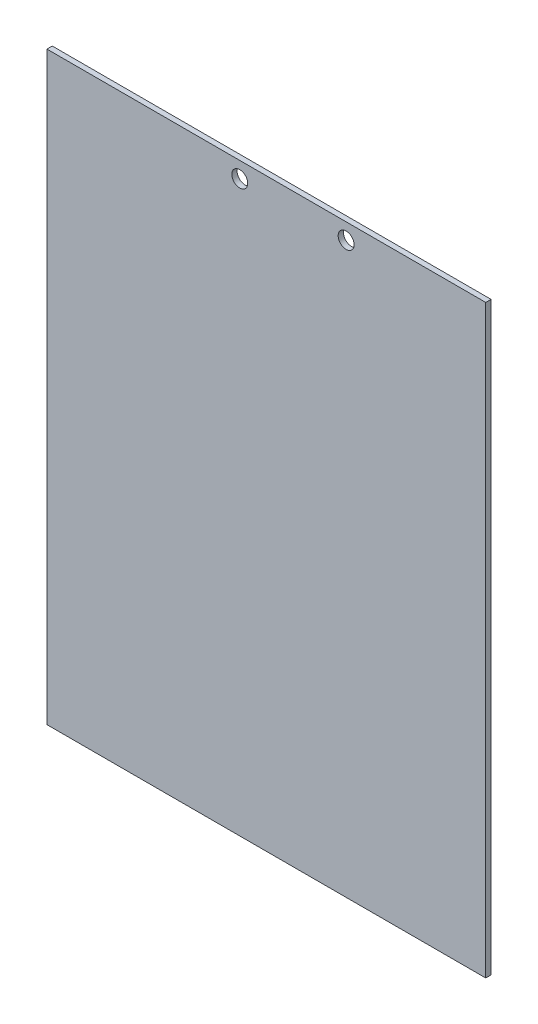
ISO-10303-21;
HEADER;
FILE_DESCRIPTION(('STEP AP214'),'2;1');
FILE_NAME('part.step','',(''),(''),'','','');
FILE_SCHEMA(('AUTOMOTIVE_DESIGN { 1 0 10303 214 1 1 1 1 }'));
ENDSEC;
DATA;
#1=APPLICATION_CONTEXT('core data for automotive mechanical design processes');
#2=APPLICATION_PROTOCOL_DEFINITION('international standard','automotive_design',2000,#1);
#3=PRODUCT_CONTEXT('',#1,'mechanical');
#4=PRODUCT('Part','Part','',(#3));
#5=PRODUCT_RELATED_PRODUCT_CATEGORY('part','',(#4));
#6=PRODUCT_DEFINITION_FORMATION('','',#4);
#7=PRODUCT_DEFINITION_CONTEXT('part definition',#1,'design');
#8=PRODUCT_DEFINITION('design','',#6,#7);
#9=PRODUCT_DEFINITION_SHAPE('','',#8);
#10=(LENGTH_UNIT() NAMED_UNIT(*) SI_UNIT(.MILLI.,.METRE.));
#11=(NAMED_UNIT(*) PLANE_ANGLE_UNIT() SI_UNIT($,.RADIAN.));
#12=(NAMED_UNIT(*) SI_UNIT($,.STERADIAN.) SOLID_ANGLE_UNIT());
#13=UNCERTAINTY_MEASURE_WITH_UNIT(LENGTH_MEASURE(1.E-05),#10,'distance_accuracy_value','');
#14=(GEOMETRIC_REPRESENTATION_CONTEXT(3) GLOBAL_UNCERTAINTY_ASSIGNED_CONTEXT((#13)) GLOBAL_UNIT_ASSIGNED_CONTEXT((#10,
#11,#12)) REPRESENTATION_CONTEXT('',''));
#15=CARTESIAN_POINT('',(0.,0.,0.));
#16=DIRECTION('',(0.,0.,1.));
#17=DIRECTION('',(1.,0.,0.));
#18=AXIS2_PLACEMENT_3D('',#15,#16,#17);
#19=CARTESIAN_POINT('',(0.,0.,1.));
#20=DIRECTION('',(0.,0.,-1.));
#21=DIRECTION('',(-1.,0.,0.));
#22=AXIS2_PLACEMENT_3D('',#19,#20,#21);
#23=PLANE('',#22);
#24=DIRECTION('',(0.,-1.,0.));
#25=VECTOR('',#24,1.);
#26=CARTESIAN_POINT('',(0.,0.,1.));
#27=LINE('',#26,#25);
#28=CARTESIAN_POINT('',(0.,110.,1.));
#29=VERTEX_POINT('',#28);
#30=CARTESIAN_POINT('',(0.,0.,1.));
#31=VERTEX_POINT('',#30);
#32=EDGE_CURVE('E93',#29,#31,#27,.T.);
#33=ORIENTED_EDGE('',*,*,#32,.T.);
#34=DIRECTION('',(1.,0.,0.));
#35=VECTOR('',#34,1.);
#36=CARTESIAN_POINT('',(0.,0.,1.));
#37=LINE('',#36,#35);
#38=CARTESIAN_POINT('',(82.5,0.,1.));
#39=VERTEX_POINT('',#38);
#40=EDGE_CURVE('E88',#31,#39,#37,.T.);
#41=ORIENTED_EDGE('',*,*,#40,.T.);
#42=DIRECTION('',(0.,1.,0.));
#43=VECTOR('',#42,1.);
#44=CARTESIAN_POINT('',(82.5,0.,1.));
#45=LINE('',#44,#43);
#46=CARTESIAN_POINT('',(82.5,110.,1.));
#47=VERTEX_POINT('',#46);
#48=EDGE_CURVE('E91',#39,#47,#45,.T.);
#49=ORIENTED_EDGE('',*,*,#48,.T.);
#50=DIRECTION('',(-1.,0.,0.));
#51=VECTOR('',#50,1.);
#52=CARTESIAN_POINT('',(0.,110.,1.));
#53=LINE('',#52,#51);
#54=EDGE_CURVE('E58',#47,#29,#53,.T.);
#55=ORIENTED_EDGE('',*,*,#54,.T.);
#56=EDGE_LOOP('',(#33,#41,#49,#55));
#57=FACE_BOUND('',#56,.T.);
#58=CARTESIAN_POINT('',(36.25,107.,1.));
#59=DIRECTION('',(0.,0.,1.));
#60=DIRECTION('',(1.,0.,0.));
#61=AXIS2_PLACEMENT_3D('',#58,#59,#60);
#62=CIRCLE('',#61,1.5);
#63=CARTESIAN_POINT('',(37.75,107.,1.));
#64=VERTEX_POINT('',#63);
#65=EDGE_CURVE('E108',#64,#64,#62,.T.);
#66=ORIENTED_EDGE('',*,*,#65,.F.);
#67=EDGE_LOOP('',(#66));
#68=FACE_BOUND('',#67,.T.);
#69=CARTESIAN_POINT('',(56.25,107.,1.));
#70=DIRECTION('',(0.,0.,1.));
#71=DIRECTION('',(1.,0.,0.));
#72=AXIS2_PLACEMENT_3D('',#69,#70,#71);
#73=CIRCLE('',#72,1.50000000000001);
#74=CARTESIAN_POINT('',(57.75,107.,1.));
#75=VERTEX_POINT('',#74);
#76=EDGE_CURVE('E123',#75,#75,#73,.T.);
#77=ORIENTED_EDGE('',*,*,#76,.F.);
#78=EDGE_LOOP('',(#77));
#79=FACE_BOUND('',#78,.T.);
#80=ADVANCED_FACE('F41',(#57,#68,#79),#23,.F.);
#81=CARTESIAN_POINT('',(0.,0.,0.));
#82=DIRECTION('',(0.,0.,-1.));
#83=DIRECTION('',(-1.,0.,0.));
#84=AXIS2_PLACEMENT_3D('',#81,#82,#83);
#85=PLANE('',#84);
#86=CARTESIAN_POINT('',(36.25,107.,0.));
#87=DIRECTION('',(0.,0.,1.));
#88=DIRECTION('',(1.,0.,0.));
#89=AXIS2_PLACEMENT_3D('',#86,#87,#88);
#90=CIRCLE('',#89,1.5);
#91=CARTESIAN_POINT('',(37.75,107.,0.));
#92=VERTEX_POINT('',#91);
#93=EDGE_CURVE('E120',#92,#92,#90,.T.);
#94=ORIENTED_EDGE('',*,*,#93,.T.);
#95=EDGE_LOOP('',(#94));
#96=FACE_BOUND('',#95,.T.);
#97=DIRECTION('',(0.,-1.,0.));
#98=VECTOR('',#97,1.);
#99=CARTESIAN_POINT('',(0.,0.,0.));
#100=LINE('',#99,#98);
#101=CARTESIAN_POINT('',(0.,110.,0.));
#102=VERTEX_POINT('',#101);
#103=CARTESIAN_POINT('',(0.,0.,0.));
#104=VERTEX_POINT('',#103);
#105=EDGE_CURVE('E105',#102,#104,#100,.T.);
#106=ORIENTED_EDGE('',*,*,#105,.F.);
#107=DIRECTION('',(-1.,0.,0.));
#108=VECTOR('',#107,1.);
#109=CARTESIAN_POINT('',(0.,110.,0.));
#110=LINE('',#109,#108);
#111=CARTESIAN_POINT('',(82.5,110.,0.));
#112=VERTEX_POINT('',#111);
#113=EDGE_CURVE('E81',#112,#102,#110,.T.);
#114=ORIENTED_EDGE('',*,*,#113,.F.);
#115=DIRECTION('',(0.,1.,0.));
#116=VECTOR('',#115,1.);
#117=CARTESIAN_POINT('',(82.5,0.,0.));
#118=LINE('',#117,#116);
#119=CARTESIAN_POINT('',(82.5,0.,0.));
#120=VERTEX_POINT('',#119);
#121=EDGE_CURVE('E75',#120,#112,#118,.T.);
#122=ORIENTED_EDGE('',*,*,#121,.F.);
#123=DIRECTION('',(1.,0.,0.));
#124=VECTOR('',#123,1.);
#125=CARTESIAN_POINT('',(0.,0.,0.));
#126=LINE('',#125,#124);
#127=EDGE_CURVE('E97',#104,#120,#126,.T.);
#128=ORIENTED_EDGE('',*,*,#127,.F.);
#129=EDGE_LOOP('',(#106,#114,#122,#128));
#130=FACE_BOUND('',#129,.T.);
#131=CARTESIAN_POINT('',(56.25,107.,0.));
#132=DIRECTION('',(0.,0.,1.));
#133=DIRECTION('',(1.,0.,0.));
#134=AXIS2_PLACEMENT_3D('',#131,#132,#133);
#135=CIRCLE('',#134,1.50000000000001);
#136=CARTESIAN_POINT('',(57.75,107.,0.));
#137=VERTEX_POINT('',#136);
#138=EDGE_CURVE('E126',#137,#137,#135,.T.);
#139=ORIENTED_EDGE('',*,*,#138,.T.);
#140=EDGE_LOOP('',(#139));
#141=FACE_BOUND('',#140,.T.);
#142=ADVANCED_FACE('F116',(#96,#130,#141),#85,.T.);
#143=CARTESIAN_POINT('',(0.,0.,1.));
#144=DIRECTION('',(1.,0.,0.));
#145=DIRECTION('',(0.,0.,-1.));
#146=AXIS2_PLACEMENT_3D('',#143,#144,#145);
#147=PLANE('',#146);
#148=ORIENTED_EDGE('',*,*,#105,.T.);
#149=DIRECTION('',(0.,0.,-1.));
#150=VECTOR('',#149,1.);
#151=CARTESIAN_POINT('',(0.,0.,1.));
#152=LINE('',#151,#150);
#153=EDGE_CURVE('E11',#31,#104,#152,.T.);
#154=ORIENTED_EDGE('',*,*,#153,.F.);
#155=ORIENTED_EDGE('',*,*,#32,.F.);
#156=DIRECTION('',(0.,0.,-1.));
#157=VECTOR('',#156,1.);
#158=CARTESIAN_POINT('',(0.,110.,1.));
#159=LINE('',#158,#157);
#160=EDGE_CURVE('E101',#29,#102,#159,.T.);
#161=ORIENTED_EDGE('',*,*,#160,.T.);
#162=EDGE_LOOP('',(#148,#154,#155,#161));
#163=FACE_BOUND('',#162,.T.);
#164=ADVANCED_FACE('F43',(#163),#147,.F.);
#165=CARTESIAN_POINT('',(0.,0.,1.));
#166=DIRECTION('',(0.,1.,0.));
#167=DIRECTION('',(0.,0.,1.));
#168=AXIS2_PLACEMENT_3D('',#165,#166,#167);
#169=PLANE('',#168);
#170=ORIENTED_EDGE('',*,*,#127,.T.);
#171=DIRECTION('',(0.,0.,-1.));
#172=VECTOR('',#171,1.);
#173=CARTESIAN_POINT('',(82.5,0.,1.));
#174=LINE('',#173,#172);
#175=EDGE_CURVE('E50',#39,#120,#174,.T.);
#176=ORIENTED_EDGE('',*,*,#175,.F.);
#177=ORIENTED_EDGE('',*,*,#40,.F.);
#178=ORIENTED_EDGE('',*,*,#153,.T.);
#179=EDGE_LOOP('',(#170,#176,#177,#178));
#180=FACE_BOUND('',#179,.T.);
#181=ADVANCED_FACE('F96',(#180),#169,.F.);
#182=CARTESIAN_POINT('',(82.5,0.,1.));
#183=DIRECTION('',(-1.,0.,0.));
#184=DIRECTION('',(0.,0.,1.));
#185=AXIS2_PLACEMENT_3D('',#182,#183,#184);
#186=PLANE('',#185);
#187=ORIENTED_EDGE('',*,*,#121,.T.);
#188=DIRECTION('',(0.,0.,-1.));
#189=VECTOR('',#188,1.);
#190=CARTESIAN_POINT('',(82.5,110.,1.));
#191=LINE('',#190,#189);
#192=EDGE_CURVE('E98',#47,#112,#191,.T.);
#193=ORIENTED_EDGE('',*,*,#192,.F.);
#194=ORIENTED_EDGE('',*,*,#48,.F.);
#195=ORIENTED_EDGE('',*,*,#175,.T.);
#196=EDGE_LOOP('',(#187,#193,#194,#195));
#197=FACE_BOUND('',#196,.T.);
#198=ADVANCED_FACE('F99',(#197),#186,.F.);
#199=CARTESIAN_POINT('',(0.,110.,1.));
#200=DIRECTION('',(0.,-1.,0.));
#201=DIRECTION('',(1.,0.,0.));
#202=AXIS2_PLACEMENT_3D('',#199,#200,#201);
#203=PLANE('',#202);
#204=ORIENTED_EDGE('',*,*,#113,.T.);
#205=ORIENTED_EDGE('',*,*,#160,.F.);
#206=ORIENTED_EDGE('',*,*,#54,.F.);
#207=ORIENTED_EDGE('',*,*,#192,.T.);
#208=EDGE_LOOP('',(#204,#205,#206,#207));
#209=FACE_BOUND('',#208,.T.);
#210=ADVANCED_FACE('F113',(#209),#203,.F.);
#211=CARTESIAN_POINT('',(36.25,107.,1.));
#212=DIRECTION('',(0.,0.,-1.));
#213=DIRECTION('',(-1.,0.,0.));
#214=AXIS2_PLACEMENT_3D('',#211,#212,#213);
#215=CYLINDRICAL_SURFACE('',#214,1.5);
#216=ORIENTED_EDGE('',*,*,#65,.T.);
#217=EDGE_LOOP('',(#216));
#218=FACE_BOUND('',#217,.T.);
#219=ORIENTED_EDGE('',*,*,#93,.F.);
#220=EDGE_LOOP('',(#219));
#221=FACE_BOUND('',#220,.T.);
#222=ADVANCED_FACE('F143',(#218,#221),#215,.F.);
#223=CARTESIAN_POINT('',(56.25,107.,1.));
#224=DIRECTION('',(0.,0.,-1.));
#225=DIRECTION('',(-1.,0.,0.));
#226=AXIS2_PLACEMENT_3D('',#223,#224,#225);
#227=CYLINDRICAL_SURFACE('',#226,1.50000000000001);
#228=ORIENTED_EDGE('',*,*,#76,.T.);
#229=EDGE_LOOP('',(#228));
#230=FACE_BOUND('',#229,.T.);
#231=ORIENTED_EDGE('',*,*,#138,.F.);
#232=EDGE_LOOP('',(#231));
#233=FACE_BOUND('',#232,.T.);
#234=ADVANCED_FACE('F132',(#230,#233),#227,.F.);
#235=CLOSED_SHELL('',(#80,#142,#164,#181,#198,#210,#222,#234));
#236=MANIFOLD_SOLID_BREP('B2',#235);
#237=ADVANCED_BREP_SHAPE_REPRESENTATION('',(#18,#236),#14);
#238=SHAPE_DEFINITION_REPRESENTATION(#9,#237);
ENDSEC;
END-ISO-10303-21;
